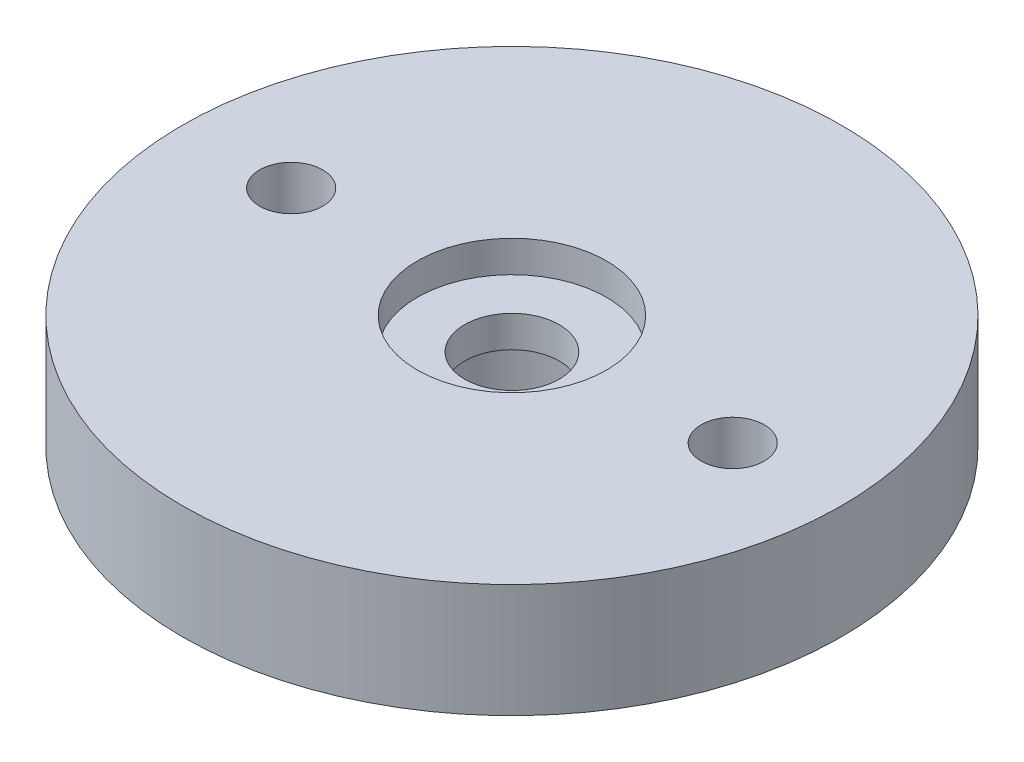
ISO-10303-21;
HEADER;
FILE_DESCRIPTION(('STEP AP214'),'2;1');
FILE_NAME('part.step','',(''),(''),'','','');
FILE_SCHEMA(('AUTOMOTIVE_DESIGN { 1 0 10303 214 1 1 1 1 }'));
ENDSEC;
DATA;
#1=APPLICATION_CONTEXT('core data for automotive mechanical design processes');
#2=APPLICATION_PROTOCOL_DEFINITION('international standard','automotive_design',2000,#1);
#3=PRODUCT_CONTEXT('',#1,'mechanical');
#4=PRODUCT('Part','Part','',(#3));
#5=PRODUCT_RELATED_PRODUCT_CATEGORY('part','',(#4));
#6=PRODUCT_DEFINITION_FORMATION('','',#4);
#7=PRODUCT_DEFINITION_CONTEXT('part definition',#1,'design');
#8=PRODUCT_DEFINITION('design','',#6,#7);
#9=PRODUCT_DEFINITION_SHAPE('','',#8);
#10=(LENGTH_UNIT() NAMED_UNIT(*) SI_UNIT(.MILLI.,.METRE.));
#11=(NAMED_UNIT(*) PLANE_ANGLE_UNIT() SI_UNIT($,.RADIAN.));
#12=(NAMED_UNIT(*) SI_UNIT($,.STERADIAN.) SOLID_ANGLE_UNIT());
#13=UNCERTAINTY_MEASURE_WITH_UNIT(LENGTH_MEASURE(1.E-05),#10,'distance_accuracy_value','');
#14=(GEOMETRIC_REPRESENTATION_CONTEXT(3) GLOBAL_UNCERTAINTY_ASSIGNED_CONTEXT((#13)) GLOBAL_UNIT_ASSIGNED_CONTEXT((#10,
#11,#12)) REPRESENTATION_CONTEXT('',''));
#15=CARTESIAN_POINT('',(0.,0.,0.));
#16=DIRECTION('',(0.,0.,1.));
#17=DIRECTION('',(1.,0.,0.));
#18=AXIS2_PLACEMENT_3D('',#15,#16,#17);
#19=CARTESIAN_POINT('',(0.,-6.,0.));
#20=DIRECTION('',(0.,1.,0.));
#21=DIRECTION('',(0.,0.,1.));
#22=AXIS2_PLACEMENT_3D('',#19,#20,#21);
#23=CYLINDRICAL_SURFACE('',#22,3.);
#24=CARTESIAN_POINT('',(0.,-6.,0.));
#25=DIRECTION('',(0.,1.,0.));
#26=DIRECTION('',(0.,0.,1.));
#27=AXIS2_PLACEMENT_3D('',#24,#25,#26);
#28=CIRCLE('',#27,3.);
#29=CARTESIAN_POINT('',(0.,-6.,3.));
#30=VERTEX_POINT('',#29);
#31=EDGE_CURVE('E62',#30,#30,#28,.T.);
#32=ORIENTED_EDGE('',*,*,#31,.F.);
#33=EDGE_LOOP('',(#32));
#34=FACE_BOUND('',#33,.T.);
#35=CARTESIAN_POINT('',(0.,-2.,0.));
#36=DIRECTION('',(0.,1.,0.));
#37=DIRECTION('',(0.,0.,1.));
#38=AXIS2_PLACEMENT_3D('',#35,#36,#37);
#39=CIRCLE('',#38,3.);
#40=CARTESIAN_POINT('',(0.,-2.,3.));
#41=VERTEX_POINT('',#40);
#42=EDGE_CURVE('E11',#41,#41,#39,.F.);
#43=ORIENTED_EDGE('',*,*,#42,.F.);
#44=EDGE_LOOP('',(#43));
#45=FACE_BOUND('',#44,.T.);
#46=ADVANCED_FACE('F39',(#34,#45),#23,.F.);
#47=CARTESIAN_POINT('',(0.,-3.6,0.));
#48=DIRECTION('',(0.,1.,0.));
#49=DIRECTION('',(0.,0.,1.));
#50=AXIS2_PLACEMENT_3D('',#47,#48,#49);
#51=CYLINDRICAL_SURFACE('',#50,10.45);
#52=CARTESIAN_POINT('',(0.,-3.6,0.));
#53=DIRECTION('',(0.,1.,0.));
#54=DIRECTION('',(0.,0.,1.));
#55=AXIS2_PLACEMENT_3D('',#52,#53,#54);
#56=CIRCLE('',#55,10.45);
#57=CARTESIAN_POINT('',(0.,-3.6,10.45));
#58=VERTEX_POINT('',#57);
#59=EDGE_CURVE('E46',#58,#58,#56,.T.);
#60=ORIENTED_EDGE('',*,*,#59,.T.);
#61=EDGE_LOOP('',(#60));
#62=FACE_BOUND('',#61,.T.);
#63=CARTESIAN_POINT('',(0.,0.,0.));
#64=DIRECTION('',(0.,1.,0.));
#65=DIRECTION('',(0.,0.,1.));
#66=AXIS2_PLACEMENT_3D('',#63,#64,#65);
#67=CIRCLE('',#66,10.45);
#68=CARTESIAN_POINT('',(0.,0.,10.45));
#69=VERTEX_POINT('',#68);
#70=EDGE_CURVE('E50',#69,#69,#67,.T.);
#71=ORIENTED_EDGE('',*,*,#70,.F.);
#72=EDGE_LOOP('',(#71));
#73=FACE_BOUND('',#72,.T.);
#74=ADVANCED_FACE('F41',(#62,#73),#51,.T.);
#75=CARTESIAN_POINT('',(0.,-3.6,0.));
#76=DIRECTION('',(0.,1.,0.));
#77=DIRECTION('',(0.,0.,1.));
#78=AXIS2_PLACEMENT_3D('',#75,#76,#77);
#79=PLANE('',#78);
#80=CARTESIAN_POINT('',(-7.,-3.6,0.));
#81=DIRECTION('',(0.,1.,0.));
#82=DIRECTION('',(0.,0.,1.));
#83=AXIS2_PLACEMENT_3D('',#80,#81,#82);
#84=CIRCLE('',#83,1.);
#85=CARTESIAN_POINT('',(-7.,-3.6,1.));
#86=VERTEX_POINT('',#85);
#87=EDGE_CURVE('E74',#86,#86,#84,.F.);
#88=ORIENTED_EDGE('',*,*,#87,.F.);
#89=EDGE_LOOP('',(#88));
#90=FACE_BOUND('',#89,.T.);
#91=CARTESIAN_POINT('',(7.,-3.6,0.));
#92=DIRECTION('',(0.,1.,0.));
#93=DIRECTION('',(0.,0.,1.));
#94=AXIS2_PLACEMENT_3D('',#91,#92,#93);
#95=CIRCLE('',#94,1.);
#96=CARTESIAN_POINT('',(7.,-3.6,1.));
#97=VERTEX_POINT('',#96);
#98=EDGE_CURVE('E66',#97,#97,#95,.F.);
#99=ORIENTED_EDGE('',*,*,#98,.F.);
#100=EDGE_LOOP('',(#99));
#101=FACE_BOUND('',#100,.T.);
#102=CARTESIAN_POINT('',(0.,-3.6,0.));
#103=DIRECTION('',(0.,1.,0.));
#104=DIRECTION('',(0.,0.,1.));
#105=AXIS2_PLACEMENT_3D('',#102,#103,#104);
#106=CIRCLE('',#105,4.25);
#107=CARTESIAN_POINT('',(0.,-3.6,4.25));
#108=VERTEX_POINT('',#107);
#109=EDGE_CURVE('E55',#108,#108,#106,.T.);
#110=ORIENTED_EDGE('',*,*,#109,.T.);
#111=EDGE_LOOP('',(#110));
#112=FACE_BOUND('',#111,.T.);
#113=ORIENTED_EDGE('',*,*,#59,.F.);
#114=EDGE_LOOP('',(#113));
#115=FACE_BOUND('',#114,.T.);
#116=ADVANCED_FACE('F116',(#90,#101,#112,#115),#79,.F.);
#117=CARTESIAN_POINT('',(0.,0.,0.));
#118=DIRECTION('',(0.,1.,0.));
#119=DIRECTION('',(0.,0.,1.));
#120=AXIS2_PLACEMENT_3D('',#117,#118,#119);
#121=PLANE('',#120);
#122=CARTESIAN_POINT('',(-7.,0.,0.));
#123=DIRECTION('',(0.,1.,0.));
#124=DIRECTION('',(0.,0.,-1.));
#125=AXIS2_PLACEMENT_3D('',#122,#123,#124);
#126=CIRCLE('',#125,1.);
#127=CARTESIAN_POINT('',(-7.,0.,1.));
#128=VERTEX_POINT('',#127);
#129=EDGE_CURVE('E77',#128,#128,#126,.T.);
#130=ORIENTED_EDGE('',*,*,#129,.F.);
#131=EDGE_LOOP('',(#130));
#132=FACE_BOUND('',#131,.T.);
#133=CARTESIAN_POINT('',(7.,0.,0.));
#134=DIRECTION('',(0.,1.,0.));
#135=DIRECTION('',(0.,0.,1.));
#136=AXIS2_PLACEMENT_3D('',#133,#134,#135);
#137=CIRCLE('',#136,1.);
#138=CARTESIAN_POINT('',(7.,0.,1.));
#139=VERTEX_POINT('',#138);
#140=EDGE_CURVE('E71',#139,#139,#137,.T.);
#141=ORIENTED_EDGE('',*,*,#140,.F.);
#142=EDGE_LOOP('',(#141));
#143=FACE_BOUND('',#142,.T.);
#144=ORIENTED_EDGE('',*,*,#70,.T.);
#145=EDGE_LOOP('',(#144));
#146=FACE_BOUND('',#145,.T.);
#147=CARTESIAN_POINT('',(0.,0.,0.));
#148=DIRECTION('',(0.,1.,0.));
#149=DIRECTION('',(0.,0.,1.));
#150=AXIS2_PLACEMENT_3D('',#147,#148,#149);
#151=CIRCLE('',#150,3.);
#152=CARTESIAN_POINT('',(0.,0.,3.));
#153=VERTEX_POINT('',#152);
#154=EDGE_CURVE('E63',#153,#153,#151,.T.);
#155=ORIENTED_EDGE('',*,*,#154,.F.);
#156=EDGE_LOOP('',(#155));
#157=FACE_BOUND('',#156,.T.);
#158=ADVANCED_FACE('F113',(#132,#143,#146,#157),#121,.T.);
#159=CARTESIAN_POINT('',(0.,-6.,0.));
#160=DIRECTION('',(0.,1.,0.));
#161=DIRECTION('',(0.,0.,1.));
#162=AXIS2_PLACEMENT_3D('',#159,#160,#161);
#163=CYLINDRICAL_SURFACE('',#162,4.25);
#164=CARTESIAN_POINT('',(0.,-6.,0.));
#165=DIRECTION('',(0.,1.,0.));
#166=DIRECTION('',(0.,0.,1.));
#167=AXIS2_PLACEMENT_3D('',#164,#165,#166);
#168=CIRCLE('',#167,4.25);
#169=CARTESIAN_POINT('',(0.,-6.,4.25));
#170=VERTEX_POINT('',#169);
#171=EDGE_CURVE('E59',#170,#170,#168,.T.);
#172=ORIENTED_EDGE('',*,*,#171,.T.);
#173=EDGE_LOOP('',(#172));
#174=FACE_BOUND('',#173,.T.);
#175=ORIENTED_EDGE('',*,*,#109,.F.);
#176=EDGE_LOOP('',(#175));
#177=FACE_BOUND('',#176,.T.);
#178=ADVANCED_FACE('F115',(#174,#177),#163,.T.);
#179=CARTESIAN_POINT('',(0.,-6.,0.));
#180=DIRECTION('',(0.,1.,0.));
#181=DIRECTION('',(0.,0.,1.));
#182=AXIS2_PLACEMENT_3D('',#179,#180,#181);
#183=PLANE('',#182);
#184=ORIENTED_EDGE('',*,*,#31,.T.);
#185=EDGE_LOOP('',(#184));
#186=FACE_BOUND('',#185,.T.);
#187=ORIENTED_EDGE('',*,*,#171,.F.);
#188=EDGE_LOOP('',(#187));
#189=FACE_BOUND('',#188,.T.);
#190=ADVANCED_FACE('F109',(#186,#189),#183,.F.);
#191=CARTESIAN_POINT('',(0.,-1.,0.));
#192=DIRECTION('',(0.,1.,0.));
#193=DIRECTION('',(0.,0.,1.));
#194=AXIS2_PLACEMENT_3D('',#191,#192,#193);
#195=CIRCLE('',#194,3.);
#196=CARTESIAN_POINT('',(0.,-1.,3.));
#197=VERTEX_POINT('',#196);
#198=EDGE_CURVE('E80',#197,#197,#195,.T.);
#199=ORIENTED_EDGE('',*,*,#198,.F.);
#200=EDGE_LOOP('',(#199));
#201=FACE_BOUND('',#200,.T.);
#202=ORIENTED_EDGE('',*,*,#154,.T.);
#203=EDGE_LOOP('',(#202));
#204=FACE_BOUND('',#203,.T.);
#205=ADVANCED_FACE('F105',(#201,#204),#23,.F.);
#206=CARTESIAN_POINT('',(7.,-6.001,0.));
#207=DIRECTION('',(0.,1.,0.));
#208=DIRECTION('',(0.,0.,1.));
#209=AXIS2_PLACEMENT_3D('',#206,#207,#208);
#210=CYLINDRICAL_SURFACE('',#209,1.);
#211=CARTESIAN_POINT('',(7.,0.,1.));
#212=CARTESIAN_POINT('',(7.,-0.0374999999999999,1.));
#213=CARTESIAN_POINT('',(7.,-0.0749999999999998,1.));
#214=CARTESIAN_POINT('',(7.,-0.15,1.));
#215=CARTESIAN_POINT('',(7.,-0.1875,1.));
#216=CARTESIAN_POINT('',(7.,-0.2625,1.));
#217=CARTESIAN_POINT('',(7.,-0.3,1.));
#218=CARTESIAN_POINT('',(7.,-0.375,1.));
#219=CARTESIAN_POINT('',(7.,-0.4125,1.));
#220=CARTESIAN_POINT('',(7.,-0.4875,1.));
#221=CARTESIAN_POINT('',(7.,-0.525,1.));
#222=CARTESIAN_POINT('',(7.,-0.6,1.));
#223=CARTESIAN_POINT('',(7.,-0.6375,1.));
#224=CARTESIAN_POINT('',(7.,-0.7125,1.));
#225=CARTESIAN_POINT('',(7.,-0.75,1.));
#226=CARTESIAN_POINT('',(7.,-0.825,1.));
#227=CARTESIAN_POINT('',(7.,-0.8625,1.));
#228=CARTESIAN_POINT('',(7.,-0.9375,1.));
#229=CARTESIAN_POINT('',(7.,-0.975,1.));
#230=CARTESIAN_POINT('',(7.,-1.05,1.));
#231=CARTESIAN_POINT('',(7.,-1.0875,1.));
#232=CARTESIAN_POINT('',(7.,-1.1625,1.));
#233=CARTESIAN_POINT('',(7.,-1.2,1.));
#234=CARTESIAN_POINT('',(7.,-1.275,1.));
#235=CARTESIAN_POINT('',(7.,-1.3125,1.));
#236=CARTESIAN_POINT('',(7.,-1.3875,1.));
#237=CARTESIAN_POINT('',(7.,-1.425,1.));
#238=CARTESIAN_POINT('',(7.,-1.5,1.));
#239=CARTESIAN_POINT('',(7.,-1.5375,1.));
#240=CARTESIAN_POINT('',(7.,-1.6125,1.));
#241=CARTESIAN_POINT('',(7.,-1.65,1.));
#242=CARTESIAN_POINT('',(7.,-1.725,1.));
#243=CARTESIAN_POINT('',(7.,-1.7625,1.));
#244=CARTESIAN_POINT('',(7.,-1.8375,1.));
#245=CARTESIAN_POINT('',(7.,-1.875,1.));
#246=CARTESIAN_POINT('',(7.,-1.95,1.));
#247=CARTESIAN_POINT('',(7.,-1.9875,1.));
#248=CARTESIAN_POINT('',(7.,-2.0625,1.));
#249=CARTESIAN_POINT('',(7.,-2.1,1.));
#250=CARTESIAN_POINT('',(7.,-2.175,1.));
#251=CARTESIAN_POINT('',(7.,-2.2125,1.));
#252=CARTESIAN_POINT('',(7.,-2.2875,1.));
#253=CARTESIAN_POINT('',(7.,-2.325,1.));
#254=CARTESIAN_POINT('',(7.,-2.4,1.));
#255=CARTESIAN_POINT('',(7.,-2.4375,1.));
#256=CARTESIAN_POINT('',(7.,-2.5125,1.));
#257=CARTESIAN_POINT('',(7.,-2.55,1.));
#258=CARTESIAN_POINT('',(7.,-2.625,1.));
#259=CARTESIAN_POINT('',(7.,-2.6625,1.));
#260=CARTESIAN_POINT('',(7.,-2.7375,1.));
#261=CARTESIAN_POINT('',(7.,-2.775,1.));
#262=CARTESIAN_POINT('',(7.,-2.85,1.));
#263=CARTESIAN_POINT('',(7.,-2.8875,1.));
#264=CARTESIAN_POINT('',(7.,-2.9625,1.));
#265=CARTESIAN_POINT('',(7.,-3.,1.));
#266=CARTESIAN_POINT('',(7.,-3.075,1.));
#267=CARTESIAN_POINT('',(7.,-3.1125,1.));
#268=CARTESIAN_POINT('',(7.,-3.1875,1.));
#269=CARTESIAN_POINT('',(7.,-3.225,1.));
#270=CARTESIAN_POINT('',(7.,-3.3,1.));
#271=CARTESIAN_POINT('',(7.,-3.3375,1.));
#272=CARTESIAN_POINT('',(7.,-3.4125,1.));
#273=CARTESIAN_POINT('',(7.,-3.45,1.));
#274=CARTESIAN_POINT('',(7.,-3.525,1.));
#275=CARTESIAN_POINT('',(7.,-3.5625,1.));
#276=CARTESIAN_POINT('',(7.,-3.6,1.));
#277=B_SPLINE_CURVE_WITH_KNOTS('',3,(#211,#212,#213,#214,#215,#216,#217,#218,#219,#220,#221,
#222,#223,#224,#225,#226,#227,#228,#229,#230,#231,#232,#233,#234,#235,#236,#237,#238,#239,#240,
#241,#242,#243,#244,#245,#246,#247,#248,#249,#250,#251,#252,#253,#254,#255,#256,#257,#258,#259,
#260,#261,#262,#263,#264,#265,#266,#267,#268,#269,#270,#271,#272,#273,#274,#275,#276),
.UNSPECIFIED.,.F.,.F.,(4,2,2,2,2,2,2,2,2,2,2,2,2,2,2,2,2,2,2,2,2,2,2,2,2,2,2,2,2,2,2,2,4),(0.,
0.1125,0.225,0.3375,0.45,0.5625,0.675,0.7875,0.9,1.0125,1.125,1.2375,1.35,1.4625,1.575,1.6875,
1.8,1.9125,2.025,2.1375,2.25,2.3625,2.475,2.5875,2.7,2.8125,2.925,3.0375,3.15,3.2625,3.375,
3.4875,3.6),.UNSPECIFIED.);
#278=EDGE_CURVE('BSEAM108',#139,#97,#277,.T.);
#279=ORIENTED_EDGE('',*,*,#140,.T.);
#280=ORIENTED_EDGE('',*,*,#98,.T.);
#281=ORIENTED_EDGE('',*,*,#278,.T.);
#282=ORIENTED_EDGE('',*,*,#278,.F.);
#283=EDGE_LOOP('',(#279,#281,#280,#282));
#284=FACE_BOUND('',#283,.T.);
#285=ADVANCED_FACE('F108',(#284),#210,.F.);
#286=CARTESIAN_POINT('',(-7.,-6.001,0.));
#287=DIRECTION('',(0.,1.,0.));
#288=DIRECTION('',(0.,0.,1.));
#289=AXIS2_PLACEMENT_3D('',#286,#287,#288);
#290=CYLINDRICAL_SURFACE('',#289,1.);
#291=CARTESIAN_POINT('',(-7.,0.,1.));
#292=CARTESIAN_POINT('',(-7.,-0.0374999999999999,1.));
#293=CARTESIAN_POINT('',(-7.,-0.0749999999999998,1.));
#294=CARTESIAN_POINT('',(-7.,-0.15,1.));
#295=CARTESIAN_POINT('',(-7.,-0.1875,1.));
#296=CARTESIAN_POINT('',(-7.,-0.2625,1.));
#297=CARTESIAN_POINT('',(-7.,-0.3,1.));
#298=CARTESIAN_POINT('',(-7.,-0.375,1.));
#299=CARTESIAN_POINT('',(-7.,-0.4125,1.));
#300=CARTESIAN_POINT('',(-7.,-0.4875,1.));
#301=CARTESIAN_POINT('',(-7.,-0.525,1.));
#302=CARTESIAN_POINT('',(-7.,-0.6,1.));
#303=CARTESIAN_POINT('',(-7.,-0.6375,1.));
#304=CARTESIAN_POINT('',(-7.,-0.7125,1.));
#305=CARTESIAN_POINT('',(-7.,-0.75,1.));
#306=CARTESIAN_POINT('',(-7.,-0.825,1.));
#307=CARTESIAN_POINT('',(-7.,-0.8625,1.));
#308=CARTESIAN_POINT('',(-7.,-0.9375,1.));
#309=CARTESIAN_POINT('',(-7.,-0.975,1.));
#310=CARTESIAN_POINT('',(-7.,-1.05,1.));
#311=CARTESIAN_POINT('',(-7.,-1.0875,1.));
#312=CARTESIAN_POINT('',(-7.,-1.1625,1.));
#313=CARTESIAN_POINT('',(-7.,-1.2,1.));
#314=CARTESIAN_POINT('',(-7.,-1.275,1.));
#315=CARTESIAN_POINT('',(-7.,-1.3125,1.));
#316=CARTESIAN_POINT('',(-7.,-1.3875,1.));
#317=CARTESIAN_POINT('',(-7.,-1.425,1.));
#318=CARTESIAN_POINT('',(-7.,-1.5,1.));
#319=CARTESIAN_POINT('',(-7.,-1.5375,1.));
#320=CARTESIAN_POINT('',(-7.,-1.6125,1.));
#321=CARTESIAN_POINT('',(-7.,-1.65,1.));
#322=CARTESIAN_POINT('',(-7.,-1.725,1.));
#323=CARTESIAN_POINT('',(-7.,-1.7625,1.));
#324=CARTESIAN_POINT('',(-7.,-1.8375,1.));
#325=CARTESIAN_POINT('',(-7.,-1.875,1.));
#326=CARTESIAN_POINT('',(-7.,-1.95,1.));
#327=CARTESIAN_POINT('',(-7.,-1.9875,1.));
#328=CARTESIAN_POINT('',(-7.,-2.0625,1.));
#329=CARTESIAN_POINT('',(-7.,-2.1,1.));
#330=CARTESIAN_POINT('',(-7.,-2.175,1.));
#331=CARTESIAN_POINT('',(-7.,-2.2125,1.));
#332=CARTESIAN_POINT('',(-7.,-2.2875,1.));
#333=CARTESIAN_POINT('',(-7.,-2.325,1.));
#334=CARTESIAN_POINT('',(-7.,-2.4,1.));
#335=CARTESIAN_POINT('',(-7.,-2.4375,1.));
#336=CARTESIAN_POINT('',(-7.,-2.5125,1.));
#337=CARTESIAN_POINT('',(-7.,-2.55,1.));
#338=CARTESIAN_POINT('',(-7.,-2.625,1.));
#339=CARTESIAN_POINT('',(-7.,-2.6625,1.));
#340=CARTESIAN_POINT('',(-7.,-2.7375,1.));
#341=CARTESIAN_POINT('',(-7.,-2.775,1.));
#342=CARTESIAN_POINT('',(-7.,-2.85,1.));
#343=CARTESIAN_POINT('',(-7.,-2.8875,1.));
#344=CARTESIAN_POINT('',(-7.,-2.9625,1.));
#345=CARTESIAN_POINT('',(-7.,-3.,1.));
#346=CARTESIAN_POINT('',(-7.,-3.075,1.));
#347=CARTESIAN_POINT('',(-7.,-3.1125,1.));
#348=CARTESIAN_POINT('',(-7.,-3.1875,1.));
#349=CARTESIAN_POINT('',(-7.,-3.225,1.));
#350=CARTESIAN_POINT('',(-7.,-3.3,1.));
#351=CARTESIAN_POINT('',(-7.,-3.3375,1.));
#352=CARTESIAN_POINT('',(-7.,-3.4125,1.));
#353=CARTESIAN_POINT('',(-7.,-3.45,1.));
#354=CARTESIAN_POINT('',(-7.,-3.525,1.));
#355=CARTESIAN_POINT('',(-7.,-3.5625,1.));
#356=CARTESIAN_POINT('',(-7.,-3.6,1.));
#357=B_SPLINE_CURVE_WITH_KNOTS('',3,(#291,#292,#293,#294,#295,#296,#297,#298,#299,#300,#301,
#302,#303,#304,#305,#306,#307,#308,#309,#310,#311,#312,#313,#314,#315,#316,#317,#318,#319,#320,
#321,#322,#323,#324,#325,#326,#327,#328,#329,#330,#331,#332,#333,#334,#335,#336,#337,#338,#339,
#340,#341,#342,#343,#344,#345,#346,#347,#348,#349,#350,#351,#352,#353,#354,#355,#356),
.UNSPECIFIED.,.F.,.F.,(4,2,2,2,2,2,2,2,2,2,2,2,2,2,2,2,2,2,2,2,2,2,2,2,2,2,2,2,2,2,2,2,4),(0.,
0.1125,0.225,0.3375,0.45,0.5625,0.675,0.7875,0.9,1.0125,1.125,1.2375,1.35,1.4625,1.575,1.6875,
1.8,1.9125,2.025,2.1375,2.25,2.3625,2.475,2.5875,2.7,2.8125,2.925,3.0375,3.15,3.2625,3.375,
3.4875,3.6),.UNSPECIFIED.);
#358=EDGE_CURVE('BSEAM101',#128,#86,#357,.T.);
#359=ORIENTED_EDGE('',*,*,#129,.T.);
#360=ORIENTED_EDGE('',*,*,#87,.T.);
#361=ORIENTED_EDGE('',*,*,#358,.T.);
#362=ORIENTED_EDGE('',*,*,#358,.F.);
#363=EDGE_LOOP('',(#359,#361,#360,#362));
#364=FACE_BOUND('',#363,.T.);
#365=ADVANCED_FACE('F101',(#364),#290,.F.);
#366=CARTESIAN_POINT('',(0.,-1.,0.));
#367=DIRECTION('',(0.,1.,0.));
#368=DIRECTION('',(0.,0.,1.));
#369=AXIS2_PLACEMENT_3D('',#366,#367,#368);
#370=PLANE('',#369);
#371=CARTESIAN_POINT('',(0.,-1.,0.));
#372=DIRECTION('',(0.,1.,0.));
#373=DIRECTION('',(0.,0.,1.));
#374=AXIS2_PLACEMENT_3D('',#371,#372,#373);
#375=CIRCLE('',#374,1.5);
#376=CARTESIAN_POINT('',(0.,-1.,1.5));
#377=VERTEX_POINT('',#376);
#378=EDGE_CURVE('E84',#377,#377,#375,.T.);
#379=ORIENTED_EDGE('',*,*,#378,.F.);
#380=EDGE_LOOP('',(#379));
#381=FACE_BOUND('',#380,.T.);
#382=ORIENTED_EDGE('',*,*,#198,.T.);
#383=EDGE_LOOP('',(#382));
#384=FACE_BOUND('',#383,.T.);
#385=ADVANCED_FACE('F98',(#381,#384),#370,.T.);
#386=CARTESIAN_POINT('',(0.,-2.,0.));
#387=DIRECTION('',(0.,1.,0.));
#388=DIRECTION('',(0.,0.,1.));
#389=AXIS2_PLACEMENT_3D('',#386,#387,#388);
#390=PLANE('',#389);
#391=CARTESIAN_POINT('',(0.,-2.,0.));
#392=DIRECTION('',(0.,1.,0.));
#393=DIRECTION('',(0.,0.,1.));
#394=AXIS2_PLACEMENT_3D('',#391,#392,#393);
#395=CIRCLE('',#394,1.5);
#396=CARTESIAN_POINT('',(0.,-2.,1.5));
#397=VERTEX_POINT('',#396);
#398=EDGE_CURVE('E83',#397,#397,#395,.T.);
#399=ORIENTED_EDGE('',*,*,#398,.T.);
#400=EDGE_LOOP('',(#399));
#401=FACE_BOUND('',#400,.T.);
#402=ORIENTED_EDGE('',*,*,#42,.T.);
#403=EDGE_LOOP('',(#402));
#404=FACE_BOUND('',#403,.T.);
#405=ADVANCED_FACE('F90',(#401,#404),#390,.F.);
#406=CARTESIAN_POINT('',(0.,-2.,0.));
#407=DIRECTION('',(0.,1.,0.));
#408=DIRECTION('',(0.,0.,1.));
#409=AXIS2_PLACEMENT_3D('',#406,#407,#408);
#410=CYLINDRICAL_SURFACE('',#409,1.5);
#411=ORIENTED_EDGE('',*,*,#398,.F.);
#412=EDGE_LOOP('',(#411));
#413=FACE_BOUND('',#412,.T.);
#414=ORIENTED_EDGE('',*,*,#378,.T.);
#415=EDGE_LOOP('',(#414));
#416=FACE_BOUND('',#415,.T.);
#417=ADVANCED_FACE('F92',(#413,#416),#410,.F.);
#418=CLOSED_SHELL('',(#46,#74,#116,#158,#178,#190,#205,#285,#365,#385,#405,#417));
#419=MANIFOLD_SOLID_BREP('B2',#418);
#420=ADVANCED_BREP_SHAPE_REPRESENTATION('',(#18,#419),#14);
#421=SHAPE_DEFINITION_REPRESENTATION(#9,#420);
ENDSEC;
END-ISO-10303-21;
